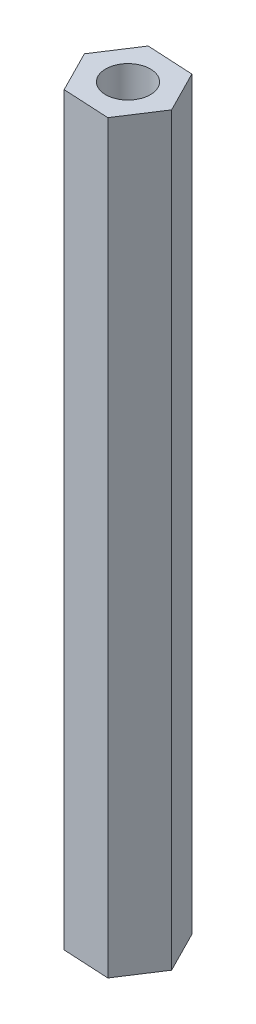
ISO-10303-21;
HEADER;
FILE_DESCRIPTION(('STEP AP214'),'2;1');
FILE_NAME('part.step','',(''),(''),'','','');
FILE_SCHEMA(('AUTOMOTIVE_DESIGN { 1 0 10303 214 1 1 1 1 }'));
ENDSEC;
DATA;
#1=APPLICATION_CONTEXT('core data for automotive mechanical design processes');
#2=APPLICATION_PROTOCOL_DEFINITION('international standard','automotive_design',2000,#1);
#3=PRODUCT_CONTEXT('',#1,'mechanical');
#4=PRODUCT('Part','Part','',(#3));
#5=PRODUCT_RELATED_PRODUCT_CATEGORY('part','',(#4));
#6=PRODUCT_DEFINITION_FORMATION('','',#4);
#7=PRODUCT_DEFINITION_CONTEXT('part definition',#1,'design');
#8=PRODUCT_DEFINITION('design','',#6,#7);
#9=PRODUCT_DEFINITION_SHAPE('','',#8);
#10=(LENGTH_UNIT() NAMED_UNIT(*) SI_UNIT(.MILLI.,.METRE.));
#11=(NAMED_UNIT(*) PLANE_ANGLE_UNIT() SI_UNIT($,.RADIAN.));
#12=(NAMED_UNIT(*) SI_UNIT($,.STERADIAN.) SOLID_ANGLE_UNIT());
#13=UNCERTAINTY_MEASURE_WITH_UNIT(LENGTH_MEASURE(1.E-05),#10,'distance_accuracy_value','');
#14=(GEOMETRIC_REPRESENTATION_CONTEXT(3) GLOBAL_UNCERTAINTY_ASSIGNED_CONTEXT((#13)) GLOBAL_UNIT_ASSIGNED_CONTEXT((#10,
#11,#12)) REPRESENTATION_CONTEXT('',''));
#15=CARTESIAN_POINT('',(0.,0.,0.));
#16=DIRECTION('',(0.,0.,1.));
#17=DIRECTION('',(1.,0.,0.));
#18=AXIS2_PLACEMENT_3D('',#15,#16,#17);
#19=CARTESIAN_POINT('',(1.54318664004275,55.,3.03675951094697));
#20=DIRECTION('',(-0.838083193513256,0.,-0.545542446332659));
#21=DIRECTION('',(-0.545542446332659,0.,0.838083193513256));
#22=AXIS2_PLACEMENT_3D('',#19,#20,#21);
#23=PLANE('',#22);
#24=DIRECTION('',(0.545542446332659,0.,-0.838083193513256));
#25=VECTOR('',#24,1.);
#26=CARTESIAN_POINT('',(1.54318664004275,0.,3.03675951094697));
#27=LINE('',#26,#25);
#28=CARTESIAN_POINT('',(1.54318664004275,0.,3.03675951094697));
#29=VERTEX_POINT('',#28);
#30=CARTESIAN_POINT('',(3.40150420168546,0.,0.181940922415713));
#31=VERTEX_POINT('',#30);
#32=EDGE_CURVE('E130',#29,#31,#27,.T.);
#33=ORIENTED_EDGE('',*,*,#32,.T.);
#34=DIRECTION('',(0.,-1.,0.));
#35=VECTOR('',#34,1.);
#36=CARTESIAN_POINT('',(3.40150420168546,55.,0.181940922415713));
#37=LINE('',#36,#35);
#38=CARTESIAN_POINT('',(3.40150420168546,55.,0.181940922415713));
#39=VERTEX_POINT('',#38);
#40=EDGE_CURVE('E11',#39,#31,#37,.T.);
#41=ORIENTED_EDGE('',*,*,#40,.F.);
#42=DIRECTION('',(0.545542446332659,0.,-0.838083193513256));
#43=VECTOR('',#42,1.);
#44=CARTESIAN_POINT('',(1.54318664004275,55.,3.03675951094697));
#45=LINE('',#44,#43);
#46=CARTESIAN_POINT('',(1.54318664004275,55.,3.03675951094697));
#47=VERTEX_POINT('',#46);
#48=EDGE_CURVE('E139',#47,#39,#45,.T.);
#49=ORIENTED_EDGE('',*,*,#48,.F.);
#50=DIRECTION('',(0.,-1.,0.));
#51=VECTOR('',#50,1.);
#52=CARTESIAN_POINT('',(1.54318664004275,55.,3.03675951094697));
#53=LINE('',#52,#51);
#54=EDGE_CURVE('E124',#47,#29,#53,.T.);
#55=ORIENTED_EDGE('',*,*,#54,.T.);
#56=EDGE_LOOP('',(#33,#41,#49,#55));
#57=FACE_BOUND('',#56,.T.);
#58=ADVANCED_FACE('F43',(#57),#23,.F.);
#59=CARTESIAN_POINT('',(3.40150420168546,55.,0.181940922415713));
#60=DIRECTION('',(-0.891495214123419,0.,0.45303011290094));
#61=DIRECTION('',(0.45303011290094,0.,0.891495214123419));
#62=AXIS2_PLACEMENT_3D('',#59,#60,#61);
#63=PLANE('',#62);
#64=DIRECTION('',(-0.45303011290094,0.,-0.891495214123419));
#65=VECTOR('',#64,1.);
#66=CARTESIAN_POINT('',(3.40150420168546,0.,0.181940922415713));
#67=LINE('',#66,#65);
#68=CARTESIAN_POINT('',(1.85831756164271,0.,-2.85481858853126));
#69=VERTEX_POINT('',#68);
#70=EDGE_CURVE('E128',#31,#69,#67,.T.);
#71=ORIENTED_EDGE('',*,*,#70,.T.);
#72=DIRECTION('',(0.,-1.,0.));
#73=VECTOR('',#72,1.);
#74=CARTESIAN_POINT('',(1.85831756164271,55.,-2.85481858853126));
#75=LINE('',#74,#73);
#76=CARTESIAN_POINT('',(1.85831756164271,55.,-2.85481858853126));
#77=VERTEX_POINT('',#76);
#78=EDGE_CURVE('E51',#77,#69,#75,.T.);
#79=ORIENTED_EDGE('',*,*,#78,.F.);
#80=DIRECTION('',(-0.45303011290094,0.,-0.891495214123419));
#81=VECTOR('',#80,1.);
#82=CARTESIAN_POINT('',(3.40150420168546,55.,0.181940922415713));
#83=LINE('',#82,#81);
#84=EDGE_CURVE('E96',#39,#77,#83,.T.);
#85=ORIENTED_EDGE('',*,*,#84,.F.);
#86=ORIENTED_EDGE('',*,*,#40,.T.);
#87=EDGE_LOOP('',(#71,#79,#85,#86));
#88=FACE_BOUND('',#87,.T.);
#89=ADVANCED_FACE('F162',(#88),#63,.F.);
#90=CARTESIAN_POINT('',(1.85831756164271,55.,-2.85481858853126));
#91=DIRECTION('',(-0.0534120206101634,0.,0.998572559233599));
#92=DIRECTION('',(0.998572559233599,0.,0.0534120206101634));
#93=AXIS2_PLACEMENT_3D('',#90,#91,#92);
#94=PLANE('',#93);
#95=DIRECTION('',(-0.998572559233599,0.,-0.0534120206101634));
#96=VECTOR('',#95,1.);
#97=CARTESIAN_POINT('',(1.85831756164271,0.,-2.85481858853126));
#98=LINE('',#97,#96);
#99=CARTESIAN_POINT('',(-1.54318664004275,0.,-3.03675951094697));
#100=VERTEX_POINT('',#99);
#101=EDGE_CURVE('E132',#69,#100,#98,.T.);
#102=ORIENTED_EDGE('',*,*,#101,.T.);
#103=DIRECTION('',(0.,-1.,0.));
#104=VECTOR('',#103,1.);
#105=CARTESIAN_POINT('',(-1.54318664004275,55.,-3.03675951094697));
#106=LINE('',#105,#104);
#107=CARTESIAN_POINT('',(-1.54318664004275,55.,-3.03675951094697));
#108=VERTEX_POINT('',#107);
#109=EDGE_CURVE('E117',#108,#100,#106,.T.);
#110=ORIENTED_EDGE('',*,*,#109,.F.);
#111=DIRECTION('',(-0.998572559233599,0.,-0.0534120206101634));
#112=VECTOR('',#111,1.);
#113=CARTESIAN_POINT('',(1.85831756164271,55.,-2.85481858853126));
#114=LINE('',#113,#112);
#115=EDGE_CURVE('E108',#77,#108,#114,.T.);
#116=ORIENTED_EDGE('',*,*,#115,.F.);
#117=ORIENTED_EDGE('',*,*,#78,.T.);
#118=EDGE_LOOP('',(#102,#110,#116,#117));
#119=FACE_BOUND('',#118,.T.);
#120=ADVANCED_FACE('F145',(#119),#94,.F.);
#121=CARTESIAN_POINT('',(-1.54318664004275,55.,-3.03675951094697));
#122=DIRECTION('',(0.838083193513256,0.,0.545542446332659));
#123=DIRECTION('',(0.545542446332659,0.,-0.838083193513256));
#124=AXIS2_PLACEMENT_3D('',#121,#122,#123);
#125=PLANE('',#124);
#126=DIRECTION('',(-0.545542446332659,0.,0.838083193513256));
#127=VECTOR('',#126,1.);
#128=CARTESIAN_POINT('',(-1.54318664004275,0.,-3.03675951094697));
#129=LINE('',#128,#127);
#130=CARTESIAN_POINT('',(-3.40150420168546,0.,-0.181940922415714));
#131=VERTEX_POINT('',#130);
#132=EDGE_CURVE('E119',#100,#131,#129,.T.);
#133=ORIENTED_EDGE('',*,*,#132,.T.);
#134=DIRECTION('',(0.,-1.,0.));
#135=VECTOR('',#134,1.);
#136=CARTESIAN_POINT('',(-3.40150420168546,55.,-0.181940922415714));
#137=LINE('',#136,#135);
#138=CARTESIAN_POINT('',(-3.40150420168546,55.,-0.181940922415714));
#139=VERTEX_POINT('',#138);
#140=EDGE_CURVE('E111',#139,#131,#137,.T.);
#141=ORIENTED_EDGE('',*,*,#140,.F.);
#142=DIRECTION('',(-0.545542446332659,0.,0.838083193513256));
#143=VECTOR('',#142,1.);
#144=CARTESIAN_POINT('',(-1.54318664004275,55.,-3.03675951094697));
#145=LINE('',#144,#143);
#146=EDGE_CURVE('E103',#108,#139,#145,.T.);
#147=ORIENTED_EDGE('',*,*,#146,.F.);
#148=ORIENTED_EDGE('',*,*,#109,.T.);
#149=EDGE_LOOP('',(#133,#141,#147,#148));
#150=FACE_BOUND('',#149,.T.);
#151=ADVANCED_FACE('F113',(#150),#125,.F.);
#152=CARTESIAN_POINT('',(-3.40150420168546,55.,-0.181940922415714));
#153=DIRECTION('',(0.89149521412342,0.,-0.45303011290094));
#154=DIRECTION('',(-0.45303011290094,0.,-0.89149521412342));
#155=AXIS2_PLACEMENT_3D('',#152,#153,#154);
#156=PLANE('',#155);
#157=DIRECTION('',(0.45303011290094,0.,0.891495214123419));
#158=VECTOR('',#157,1.);
#159=CARTESIAN_POINT('',(-3.40150420168546,0.,-0.181940922415714));
#160=LINE('',#159,#158);
#161=CARTESIAN_POINT('',(-1.85831756164271,0.,2.85481858853126));
#162=VERTEX_POINT('',#161);
#163=EDGE_CURVE('E82',#131,#162,#160,.T.);
#164=ORIENTED_EDGE('',*,*,#163,.T.);
#165=DIRECTION('',(0.,-1.,0.));
#166=VECTOR('',#165,1.);
#167=CARTESIAN_POINT('',(-1.85831756164271,55.,2.85481858853126));
#168=LINE('',#167,#166);
#169=CARTESIAN_POINT('',(-1.85831756164271,55.,2.85481858853126));
#170=VERTEX_POINT('',#169);
#171=EDGE_CURVE('E120',#170,#162,#168,.T.);
#172=ORIENTED_EDGE('',*,*,#171,.F.);
#173=DIRECTION('',(0.45303011290094,0.,0.891495214123419));
#174=VECTOR('',#173,1.);
#175=CARTESIAN_POINT('',(-3.40150420168546,55.,-0.181940922415714));
#176=LINE('',#175,#174);
#177=EDGE_CURVE('E110',#139,#170,#176,.T.);
#178=ORIENTED_EDGE('',*,*,#177,.F.);
#179=ORIENTED_EDGE('',*,*,#140,.T.);
#180=EDGE_LOOP('',(#164,#172,#178,#179));
#181=FACE_BOUND('',#180,.T.);
#182=ADVANCED_FACE('F121',(#181),#156,.F.);
#183=CARTESIAN_POINT('',(-1.85831756164271,55.,2.85481858853126));
#184=DIRECTION('',(0.0534120206101633,0.,-0.998572559233599));
#185=DIRECTION('',(-0.998572559233599,0.,-0.0534120206101634));
#186=AXIS2_PLACEMENT_3D('',#183,#184,#185);
#187=PLANE('',#186);
#188=DIRECTION('',(0.998572559233599,0.,0.0534120206101633));
#189=VECTOR('',#188,1.);
#190=CARTESIAN_POINT('',(-1.85831756164271,0.,2.85481858853126));
#191=LINE('',#190,#189);
#192=EDGE_CURVE('E86',#162,#29,#191,.T.);
#193=ORIENTED_EDGE('',*,*,#192,.T.);
#194=ORIENTED_EDGE('',*,*,#54,.F.);
#195=DIRECTION('',(0.998572559233599,0.,0.0534120206101633));
#196=VECTOR('',#195,1.);
#197=CARTESIAN_POINT('',(-1.85831756164271,55.,2.85481858853126));
#198=LINE('',#197,#196);
#199=EDGE_CURVE('E56',#170,#47,#198,.T.);
#200=ORIENTED_EDGE('',*,*,#199,.F.);
#201=ORIENTED_EDGE('',*,*,#171,.T.);
#202=EDGE_LOOP('',(#193,#194,#200,#201));
#203=FACE_BOUND('',#202,.T.);
#204=ADVANCED_FACE('F151',(#203),#187,.F.);
#205=CARTESIAN_POINT('',(0.,55.,0.));
#206=DIRECTION('',(0.,1.,0.));
#207=DIRECTION('',(0.,0.,1.));
#208=AXIS2_PLACEMENT_3D('',#205,#206,#207);
#209=PLANE('',#208);
#210=CARTESIAN_POINT('',(0.,55.,0.));
#211=DIRECTION('',(0.,1.,0.));
#212=DIRECTION('',(0.,0.,1.));
#213=AXIS2_PLACEMENT_3D('',#210,#211,#212);
#214=CIRCLE('',#213,1.64999999999999);
#215=CARTESIAN_POINT('',(0.,55.,1.64999999999999));
#216=VERTEX_POINT('',#215);
#217=EDGE_CURVE('E222',#216,#216,#214,.T.);
#218=ORIENTED_EDGE('',*,*,#217,.F.);
#219=EDGE_LOOP('',(#218));
#220=FACE_BOUND('',#219,.T.);
#221=ORIENTED_EDGE('',*,*,#48,.T.);
#222=ORIENTED_EDGE('',*,*,#84,.T.);
#223=ORIENTED_EDGE('',*,*,#115,.T.);
#224=ORIENTED_EDGE('',*,*,#146,.T.);
#225=ORIENTED_EDGE('',*,*,#177,.T.);
#226=ORIENTED_EDGE('',*,*,#199,.T.);
#227=EDGE_LOOP('',(#221,#222,#223,#224,#225,#226));
#228=FACE_BOUND('',#227,.T.);
#229=ADVANCED_FACE('F104',(#220,#228),#209,.T.);
#230=CARTESIAN_POINT('',(0.,0.,0.));
#231=DIRECTION('',(0.,1.,0.));
#232=DIRECTION('',(0.,0.,1.));
#233=AXIS2_PLACEMENT_3D('',#230,#231,#232);
#234=PLANE('',#233);
#235=CARTESIAN_POINT('',(0.,0.,0.));
#236=DIRECTION('',(0.,1.,0.));
#237=DIRECTION('',(0.,0.,1.));
#238=AXIS2_PLACEMENT_3D('',#235,#236,#237);
#239=CIRCLE('',#238,1.64999999999999);
#240=CARTESIAN_POINT('',(0.,0.,1.64999999999999));
#241=VERTEX_POINT('',#240);
#242=EDGE_CURVE('E133',#241,#241,#239,.T.);
#243=ORIENTED_EDGE('',*,*,#242,.T.);
#244=EDGE_LOOP('',(#243));
#245=FACE_BOUND('',#244,.T.);
#246=ORIENTED_EDGE('',*,*,#32,.F.);
#247=ORIENTED_EDGE('',*,*,#192,.F.);
#248=ORIENTED_EDGE('',*,*,#163,.F.);
#249=ORIENTED_EDGE('',*,*,#132,.F.);
#250=ORIENTED_EDGE('',*,*,#101,.F.);
#251=ORIENTED_EDGE('',*,*,#70,.F.);
#252=EDGE_LOOP('',(#246,#247,#248,#249,#250,#251));
#253=FACE_BOUND('',#252,.T.);
#254=ADVANCED_FACE('F150',(#245,#253),#234,.F.);
#255=CARTESIAN_POINT('',(0.,55.,0.));
#256=DIRECTION('',(0.,1.,0.));
#257=DIRECTION('',(0.,0.,1.));
#258=AXIS2_PLACEMENT_3D('',#255,#256,#257);
#259=CYLINDRICAL_SURFACE('',#258,1.64999999999999);
#260=ORIENTED_EDGE('',*,*,#242,.F.);
#261=EDGE_LOOP('',(#260));
#262=FACE_BOUND('',#261,.T.);
#263=ORIENTED_EDGE('',*,*,#217,.T.);
#264=EDGE_LOOP('',(#263));
#265=FACE_BOUND('',#264,.T.);
#266=ADVANCED_FACE('F205',(#262,#265),#259,.F.);
#267=CLOSED_SHELL('',(#58,#89,#120,#151,#182,#204,#229,#254,#266));
#268=MANIFOLD_SOLID_BREP('B2',#267);
#269=ADVANCED_BREP_SHAPE_REPRESENTATION('',(#18,#268),#14);
#270=SHAPE_DEFINITION_REPRESENTATION(#9,#269);
ENDSEC;
END-ISO-10303-21;
